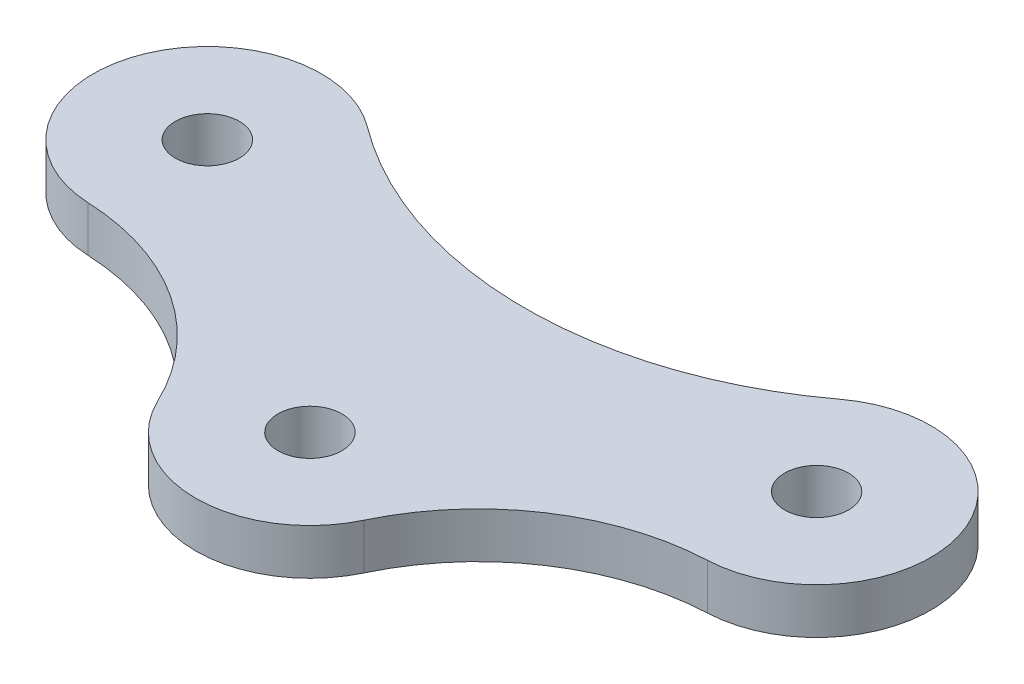
ISO-10303-21;
HEADER;
FILE_DESCRIPTION(('STEP AP214'),'2;1');
FILE_NAME('part.step','',(''),(''),'','','');
FILE_SCHEMA(('AUTOMOTIVE_DESIGN { 1 0 10303 214 1 1 1 1 }'));
ENDSEC;
DATA;
#1=APPLICATION_CONTEXT('core data for automotive mechanical design processes');
#2=APPLICATION_PROTOCOL_DEFINITION('international standard','automotive_design',2000,#1);
#3=PRODUCT_CONTEXT('',#1,'mechanical');
#4=PRODUCT('Part','Part','',(#3));
#5=PRODUCT_RELATED_PRODUCT_CATEGORY('part','',(#4));
#6=PRODUCT_DEFINITION_FORMATION('','',#4);
#7=PRODUCT_DEFINITION_CONTEXT('part definition',#1,'design');
#8=PRODUCT_DEFINITION('design','',#6,#7);
#9=PRODUCT_DEFINITION_SHAPE('','',#8);
#10=(LENGTH_UNIT() NAMED_UNIT(*) SI_UNIT(.MILLI.,.METRE.));
#11=(NAMED_UNIT(*) PLANE_ANGLE_UNIT() SI_UNIT($,.RADIAN.));
#12=(NAMED_UNIT(*) SI_UNIT($,.STERADIAN.) SOLID_ANGLE_UNIT());
#13=UNCERTAINTY_MEASURE_WITH_UNIT(LENGTH_MEASURE(1.E-05),#10,'distance_accuracy_value','');
#14=(GEOMETRIC_REPRESENTATION_CONTEXT(3) GLOBAL_UNCERTAINTY_ASSIGNED_CONTEXT((#13)) GLOBAL_UNIT_ASSIGNED_CONTEXT((#10,
#11,#12)) REPRESENTATION_CONTEXT('',''));
#15=CARTESIAN_POINT('',(0.,0.,0.));
#16=DIRECTION('',(0.,0.,1.));
#17=DIRECTION('',(1.,0.,0.));
#18=AXIS2_PLACEMENT_3D('',#15,#16,#17);
#19=CARTESIAN_POINT('',(10.,3.,-26.6332495807108));
#20=DIRECTION('',(0.,1.,0.));
#21=DIRECTION('',(0.,0.,1.));
#22=AXIS2_PLACEMENT_3D('',#19,#20,#21);
#23=PLANE('',#22);
#24=CARTESIAN_POINT('',(20.,3.,-13.2664991614216));
#25=DIRECTION('',(0.,1.,0.));
#26=DIRECTION('',(0.,0.,1.));
#27=AXIS2_PLACEMENT_3D('',#24,#25,#26);
#28=CIRCLE('',#27,2.1);
#29=CARTESIAN_POINT('',(20.,3.,-11.1664991614216));
#30=VERTEX_POINT('',#29);
#31=EDGE_CURVE('E184',#30,#30,#28,.T.);
#32=ORIENTED_EDGE('',*,*,#31,.F.);
#33=EDGE_LOOP('',(#32));
#34=FACE_BOUND('',#33,.T.);
#35=CARTESIAN_POINT('',(0.,3.,-40.));
#36=DIRECTION('',(0.,-1.,0.));
#37=DIRECTION('',(0.,0.,1.));
#38=AXIS2_PLACEMENT_3D('',#35,#36,#37);
#39=CIRCLE('',#38,25.8868247529811);
#40=CARTESIAN_POINT('',(15.5072097718245,3.,-19.2718997280459));
#41=VERTEX_POINT('',#40);
#42=CARTESIAN_POINT('',(-15.5072097718245,3.,-19.2718997280459));
#43=VERTEX_POINT('',#42);
#44=EDGE_CURVE('E129',#41,#43,#39,.T.);
#45=ORIENTED_EDGE('',*,*,#44,.T.);
#46=CARTESIAN_POINT('',(-20.,3.,-13.2664991614216));
#47=DIRECTION('',(0.,1.,0.));
#48=DIRECTION('',(0.,0.,1.));
#49=AXIS2_PLACEMENT_3D('',#46,#47,#48);
#50=CIRCLE('',#49,7.5);
#51=CARTESIAN_POINT('',(-20.3327420028076,3.,-5.77388394645376));
#52=VERTEX_POINT('',#51);
#53=EDGE_CURVE('E87',#43,#52,#50,.T.);
#54=ORIENTED_EDGE('',*,*,#53,.T.);
#55=CARTESIAN_POINT('',(-21.0332495807108,3.,10.));
#56=DIRECTION('',(0.,-1.,0.));
#57=DIRECTION('',(0.,0.,-1.));
#58=AXIS2_PLACEMENT_3D('',#55,#56,#57);
#59=CIRCLE('',#58,15.7894308201053);
#60=CARTESIAN_POINT('',(-6.7734318229516,3.,3.22034491007199));
#61=VERTEX_POINT('',#60);
#62=EDGE_CURVE('E100',#52,#61,#59,.T.);
#63=ORIENTED_EDGE('',*,*,#62,.T.);
#64=CARTESIAN_POINT('',(0.,3.,0.));
#65=DIRECTION('',(0.,1.,0.));
#66=DIRECTION('',(0.,0.,1.));
#67=AXIS2_PLACEMENT_3D('',#64,#65,#66);
#68=CIRCLE('',#67,7.5);
#69=CARTESIAN_POINT('',(6.7734318229516,3.,3.220344910072));
#70=VERTEX_POINT('',#69);
#71=EDGE_CURVE('E94',#61,#70,#68,.T.);
#72=ORIENTED_EDGE('',*,*,#71,.T.);
#73=CARTESIAN_POINT('',(21.0332495807108,3.,10.));
#74=DIRECTION('',(0.,-1.,0.));
#75=DIRECTION('',(0.,0.,1.));
#76=AXIS2_PLACEMENT_3D('',#73,#74,#75);
#77=CIRCLE('',#76,15.7894308201053);
#78=CARTESIAN_POINT('',(20.3327420028076,3.,-5.77388394645376));
#79=VERTEX_POINT('',#78);
#80=EDGE_CURVE('E98',#70,#79,#77,.T.);
#81=ORIENTED_EDGE('',*,*,#80,.T.);
#82=CARTESIAN_POINT('',(20.,3.,-13.2664991614216));
#83=DIRECTION('',(0.,1.,0.));
#84=DIRECTION('',(0.,0.,1.));
#85=AXIS2_PLACEMENT_3D('',#82,#83,#84);
#86=CIRCLE('',#85,7.5);
#87=EDGE_CURVE('E50',#79,#41,#86,.T.);
#88=ORIENTED_EDGE('',*,*,#87,.T.);
#89=EDGE_LOOP('',(#45,#54,#63,#72,#81,#88));
#90=FACE_BOUND('',#89,.T.);
#91=CARTESIAN_POINT('',(0.,3.,0.));
#92=DIRECTION('',(0.,1.,0.));
#93=DIRECTION('',(0.,0.,1.));
#94=AXIS2_PLACEMENT_3D('',#91,#92,#93);
#95=CIRCLE('',#94,2.1);
#96=CARTESIAN_POINT('',(0.,3.,2.1));
#97=VERTEX_POINT('',#96);
#98=EDGE_CURVE('E122',#97,#97,#95,.T.);
#99=ORIENTED_EDGE('',*,*,#98,.F.);
#100=EDGE_LOOP('',(#99));
#101=FACE_BOUND('',#100,.T.);
#102=CARTESIAN_POINT('',(-20.,3.,-13.2664991614216));
#103=DIRECTION('',(0.,1.,0.));
#104=DIRECTION('',(0.,0.,1.));
#105=AXIS2_PLACEMENT_3D('',#102,#103,#104);
#106=CIRCLE('',#105,2.1);
#107=CARTESIAN_POINT('',(-20.,3.,-11.1664991614216));
#108=VERTEX_POINT('',#107);
#109=EDGE_CURVE('E175',#108,#108,#106,.T.);
#110=ORIENTED_EDGE('',*,*,#109,.F.);
#111=EDGE_LOOP('',(#110));
#112=FACE_BOUND('',#111,.T.);
#113=ADVANCED_FACE('F33',(#34,#90,#101,#112),#23,.T.);
#114=CARTESIAN_POINT('',(10.,0.,-26.6332495807108));
#115=DIRECTION('',(0.,1.,0.));
#116=DIRECTION('',(0.,0.,1.));
#117=AXIS2_PLACEMENT_3D('',#114,#115,#116);
#118=PLANE('',#117);
#119=CARTESIAN_POINT('',(0.,0.,-40.));
#120=DIRECTION('',(0.,-1.,0.));
#121=DIRECTION('',(0.,0.,1.));
#122=AXIS2_PLACEMENT_3D('',#119,#120,#121);
#123=CIRCLE('',#122,25.8868247529811);
#124=CARTESIAN_POINT('',(15.5072097718245,0.,-19.2718997280459));
#125=VERTEX_POINT('',#124);
#126=CARTESIAN_POINT('',(-15.5072097718245,0.,-19.2718997280459));
#127=VERTEX_POINT('',#126);
#128=EDGE_CURVE('E118',#125,#127,#123,.T.);
#129=ORIENTED_EDGE('',*,*,#128,.F.);
#130=CARTESIAN_POINT('',(20.,0.,-13.2664991614216));
#131=DIRECTION('',(0.,1.,0.));
#132=DIRECTION('',(0.,0.,1.));
#133=AXIS2_PLACEMENT_3D('',#130,#131,#132);
#134=CIRCLE('',#133,7.5);
#135=CARTESIAN_POINT('',(20.3327420028076,0.,-5.77388394645376));
#136=VERTEX_POINT('',#135);
#137=EDGE_CURVE('E79',#136,#125,#134,.T.);
#138=ORIENTED_EDGE('',*,*,#137,.F.);
#139=CARTESIAN_POINT('',(21.0332495807108,0.,10.));
#140=DIRECTION('',(0.,-1.,0.));
#141=DIRECTION('',(0.,0.,1.));
#142=AXIS2_PLACEMENT_3D('',#139,#140,#141);
#143=CIRCLE('',#142,15.7894308201053);
#144=CARTESIAN_POINT('',(6.7734318229516,0.,3.220344910072));
#145=VERTEX_POINT('',#144);
#146=EDGE_CURVE('E73',#145,#136,#143,.T.);
#147=ORIENTED_EDGE('',*,*,#146,.F.);
#148=CARTESIAN_POINT('',(0.,0.,0.));
#149=DIRECTION('',(0.,1.,0.));
#150=DIRECTION('',(0.,0.,1.));
#151=AXIS2_PLACEMENT_3D('',#148,#149,#150);
#152=CIRCLE('',#151,7.5);
#153=CARTESIAN_POINT('',(-6.7734318229516,0.,3.22034491007199));
#154=VERTEX_POINT('',#153);
#155=EDGE_CURVE('E108',#154,#145,#152,.T.);
#156=ORIENTED_EDGE('',*,*,#155,.F.);
#157=CARTESIAN_POINT('',(-21.0332495807108,0.,10.));
#158=DIRECTION('',(0.,-1.,0.));
#159=DIRECTION('',(0.,0.,-1.));
#160=AXIS2_PLACEMENT_3D('',#157,#158,#159);
#161=CIRCLE('',#160,15.7894308201053);
#162=CARTESIAN_POINT('',(-20.3327420028076,0.,-5.77388394645376));
#163=VERTEX_POINT('',#162);
#164=EDGE_CURVE('E124',#163,#154,#161,.T.);
#165=ORIENTED_EDGE('',*,*,#164,.F.);
#166=CARTESIAN_POINT('',(-20.,0.,-13.2664991614216));
#167=DIRECTION('',(0.,1.,0.));
#168=DIRECTION('',(0.,0.,1.));
#169=AXIS2_PLACEMENT_3D('',#166,#167,#168);
#170=CIRCLE('',#169,7.5);
#171=EDGE_CURVE('E121',#127,#163,#170,.T.);
#172=ORIENTED_EDGE('',*,*,#171,.F.);
#173=EDGE_LOOP('',(#129,#138,#147,#156,#165,#172));
#174=FACE_BOUND('',#173,.T.);
#175=CARTESIAN_POINT('',(0.,0.,0.));
#176=DIRECTION('',(0.,1.,0.));
#177=DIRECTION('',(0.,0.,1.));
#178=AXIS2_PLACEMENT_3D('',#175,#176,#177);
#179=CIRCLE('',#178,2.1);
#180=CARTESIAN_POINT('',(0.,0.,2.1));
#181=VERTEX_POINT('',#180);
#182=EDGE_CURVE('E187',#181,#181,#179,.T.);
#183=ORIENTED_EDGE('',*,*,#182,.T.);
#184=EDGE_LOOP('',(#183));
#185=FACE_BOUND('',#184,.T.);
#186=CARTESIAN_POINT('',(20.,0.,-13.2664991614216));
#187=DIRECTION('',(0.,1.,0.));
#188=DIRECTION('',(0.,0.,1.));
#189=AXIS2_PLACEMENT_3D('',#186,#187,#188);
#190=CIRCLE('',#189,2.1);
#191=CARTESIAN_POINT('',(20.,0.,-11.1664991614216));
#192=VERTEX_POINT('',#191);
#193=EDGE_CURVE('E181',#192,#192,#190,.T.);
#194=ORIENTED_EDGE('',*,*,#193,.T.);
#195=EDGE_LOOP('',(#194));
#196=FACE_BOUND('',#195,.T.);
#197=CARTESIAN_POINT('',(-20.,0.,-13.2664991614216));
#198=DIRECTION('',(0.,1.,0.));
#199=DIRECTION('',(0.,0.,1.));
#200=AXIS2_PLACEMENT_3D('',#197,#198,#199);
#201=CIRCLE('',#200,2.1);
#202=CARTESIAN_POINT('',(-20.,0.,-11.1664991614216));
#203=VERTEX_POINT('',#202);
#204=EDGE_CURVE('E178',#203,#203,#201,.T.);
#205=ORIENTED_EDGE('',*,*,#204,.T.);
#206=EDGE_LOOP('',(#205));
#207=FACE_BOUND('',#206,.T.);
#208=ADVANCED_FACE('F138',(#174,#185,#196,#207),#118,.F.);
#209=CARTESIAN_POINT('',(0.,3.,-40.));
#210=DIRECTION('',(0.,-1.,0.));
#211=DIRECTION('',(0.,0.,-1.));
#212=AXIS2_PLACEMENT_3D('',#209,#210,#211);
#213=CYLINDRICAL_SURFACE('',#212,25.8868247529811);
#214=ORIENTED_EDGE('',*,*,#128,.T.);
#215=DIRECTION('',(0.,-1.,0.));
#216=VECTOR('',#215,1.);
#217=CARTESIAN_POINT('',(-15.5072097718245,3.,-19.2718997280459));
#218=LINE('',#217,#216);
#219=EDGE_CURVE('E11',#43,#127,#218,.T.);
#220=ORIENTED_EDGE('',*,*,#219,.F.);
#221=ORIENTED_EDGE('',*,*,#44,.F.);
#222=DIRECTION('',(0.,-1.,0.));
#223=VECTOR('',#222,1.);
#224=CARTESIAN_POINT('',(15.5072097718245,3.,-19.2718997280459));
#225=LINE('',#224,#223);
#226=EDGE_CURVE('E114',#41,#125,#225,.T.);
#227=ORIENTED_EDGE('',*,*,#226,.T.);
#228=EDGE_LOOP('',(#214,#220,#221,#227));
#229=FACE_BOUND('',#228,.T.);
#230=ADVANCED_FACE('F35',(#229),#213,.F.);
#231=CARTESIAN_POINT('',(-20.,3.,-13.2664991614216));
#232=DIRECTION('',(0.,-1.,0.));
#233=DIRECTION('',(0.,0.,-1.));
#234=AXIS2_PLACEMENT_3D('',#231,#232,#233);
#235=CYLINDRICAL_SURFACE('',#234,7.5);
#236=ORIENTED_EDGE('',*,*,#171,.T.);
#237=DIRECTION('',(0.,-1.,0.));
#238=VECTOR('',#237,1.);
#239=CARTESIAN_POINT('',(-20.3327420028076,3.,-5.77388394645376));
#240=LINE('',#239,#238);
#241=EDGE_CURVE('E42',#52,#163,#240,.T.);
#242=ORIENTED_EDGE('',*,*,#241,.F.);
#243=ORIENTED_EDGE('',*,*,#53,.F.);
#244=ORIENTED_EDGE('',*,*,#219,.T.);
#245=EDGE_LOOP('',(#236,#242,#243,#244));
#246=FACE_BOUND('',#245,.T.);
#247=ADVANCED_FACE('F237',(#246),#235,.T.);
#248=CARTESIAN_POINT('',(-21.0332495807108,3.,10.));
#249=DIRECTION('',(0.,-1.,0.));
#250=DIRECTION('',(0.,0.,-1.));
#251=AXIS2_PLACEMENT_3D('',#248,#249,#250);
#252=CYLINDRICAL_SURFACE('',#251,15.7894308201053);
#253=ORIENTED_EDGE('',*,*,#164,.T.);
#254=DIRECTION('',(0.,-1.,0.));
#255=VECTOR('',#254,1.);
#256=CARTESIAN_POINT('',(-6.7734318229516,3.,3.22034491007199));
#257=LINE('',#256,#255);
#258=EDGE_CURVE('E109',#61,#154,#257,.T.);
#259=ORIENTED_EDGE('',*,*,#258,.F.);
#260=ORIENTED_EDGE('',*,*,#62,.F.);
#261=ORIENTED_EDGE('',*,*,#241,.T.);
#262=EDGE_LOOP('',(#253,#259,#260,#261));
#263=FACE_BOUND('',#262,.T.);
#264=ADVANCED_FACE('F135',(#263),#252,.F.);
#265=CARTESIAN_POINT('',(0.,3.,0.));
#266=DIRECTION('',(0.,-1.,0.));
#267=DIRECTION('',(0.,0.,-1.));
#268=AXIS2_PLACEMENT_3D('',#265,#266,#267);
#269=CYLINDRICAL_SURFACE('',#268,7.5);
#270=ORIENTED_EDGE('',*,*,#155,.T.);
#271=DIRECTION('',(0.,-1.,0.));
#272=VECTOR('',#271,1.);
#273=CARTESIAN_POINT('',(6.7734318229516,3.,3.220344910072));
#274=LINE('',#273,#272);
#275=EDGE_CURVE('E105',#70,#145,#274,.T.);
#276=ORIENTED_EDGE('',*,*,#275,.F.);
#277=ORIENTED_EDGE('',*,*,#71,.F.);
#278=ORIENTED_EDGE('',*,*,#258,.T.);
#279=EDGE_LOOP('',(#270,#276,#277,#278));
#280=FACE_BOUND('',#279,.T.);
#281=ADVANCED_FACE('F106',(#280),#269,.T.);
#282=CARTESIAN_POINT('',(21.0332495807108,3.,10.));
#283=DIRECTION('',(0.,-1.,0.));
#284=DIRECTION('',(0.,0.,-1.));
#285=AXIS2_PLACEMENT_3D('',#282,#283,#284);
#286=CYLINDRICAL_SURFACE('',#285,15.7894308201053);
#287=ORIENTED_EDGE('',*,*,#146,.T.);
#288=DIRECTION('',(0.,-1.,0.));
#289=VECTOR('',#288,1.);
#290=CARTESIAN_POINT('',(20.3327420028076,3.,-5.77388394645376));
#291=LINE('',#290,#289);
#292=EDGE_CURVE('E110',#79,#136,#291,.T.);
#293=ORIENTED_EDGE('',*,*,#292,.F.);
#294=ORIENTED_EDGE('',*,*,#80,.F.);
#295=ORIENTED_EDGE('',*,*,#275,.T.);
#296=EDGE_LOOP('',(#287,#293,#294,#295));
#297=FACE_BOUND('',#296,.T.);
#298=ADVANCED_FACE('F112',(#297),#286,.F.);
#299=CARTESIAN_POINT('',(20.,3.,-13.2664991614216));
#300=DIRECTION('',(0.,-1.,0.));
#301=DIRECTION('',(0.,0.,-1.));
#302=AXIS2_PLACEMENT_3D('',#299,#300,#301);
#303=CYLINDRICAL_SURFACE('',#302,7.5);
#304=ORIENTED_EDGE('',*,*,#137,.T.);
#305=ORIENTED_EDGE('',*,*,#226,.F.);
#306=ORIENTED_EDGE('',*,*,#87,.F.);
#307=ORIENTED_EDGE('',*,*,#292,.T.);
#308=EDGE_LOOP('',(#304,#305,#306,#307));
#309=FACE_BOUND('',#308,.T.);
#310=ADVANCED_FACE('F143',(#309),#303,.T.);
#311=CARTESIAN_POINT('',(0.,3.,0.));
#312=DIRECTION('',(0.,-1.,0.));
#313=DIRECTION('',(0.,0.,-1.));
#314=AXIS2_PLACEMENT_3D('',#311,#312,#313);
#315=CYLINDRICAL_SURFACE('',#314,2.1);
#316=ORIENTED_EDGE('',*,*,#98,.T.);
#317=EDGE_LOOP('',(#316));
#318=FACE_BOUND('',#317,.T.);
#319=ORIENTED_EDGE('',*,*,#182,.F.);
#320=EDGE_LOOP('',(#319));
#321=FACE_BOUND('',#320,.T.);
#322=ADVANCED_FACE('F145',(#318,#321),#315,.F.);
#323=CARTESIAN_POINT('',(20.,3.,-13.2664991614216));
#324=DIRECTION('',(0.,-1.,0.));
#325=DIRECTION('',(0.,0.,-1.));
#326=AXIS2_PLACEMENT_3D('',#323,#324,#325);
#327=CYLINDRICAL_SURFACE('',#326,2.1);
#328=ORIENTED_EDGE('',*,*,#31,.T.);
#329=EDGE_LOOP('',(#328));
#330=FACE_BOUND('',#329,.T.);
#331=ORIENTED_EDGE('',*,*,#193,.F.);
#332=EDGE_LOOP('',(#331));
#333=FACE_BOUND('',#332,.T.);
#334=ADVANCED_FACE('F151',(#330,#333),#327,.F.);
#335=CARTESIAN_POINT('',(-20.,3.,-13.2664991614216));
#336=DIRECTION('',(0.,-1.,0.));
#337=DIRECTION('',(0.,0.,-1.));
#338=AXIS2_PLACEMENT_3D('',#335,#336,#337);
#339=CYLINDRICAL_SURFACE('',#338,2.1);
#340=ORIENTED_EDGE('',*,*,#109,.T.);
#341=EDGE_LOOP('',(#340));
#342=FACE_BOUND('',#341,.T.);
#343=ORIENTED_EDGE('',*,*,#204,.F.);
#344=EDGE_LOOP('',(#343));
#345=FACE_BOUND('',#344,.T.);
#346=ADVANCED_FACE('F166',(#342,#345),#339,.F.);
#347=CLOSED_SHELL('',(#113,#208,#230,#247,#264,#281,#298,#310,#322,#334,#346));
#348=MANIFOLD_SOLID_BREP('B2',#347);
#349=ADVANCED_BREP_SHAPE_REPRESENTATION('',(#18,#348),#14);
#350=SHAPE_DEFINITION_REPRESENTATION(#9,#349);
ENDSEC;
END-ISO-10303-21;
